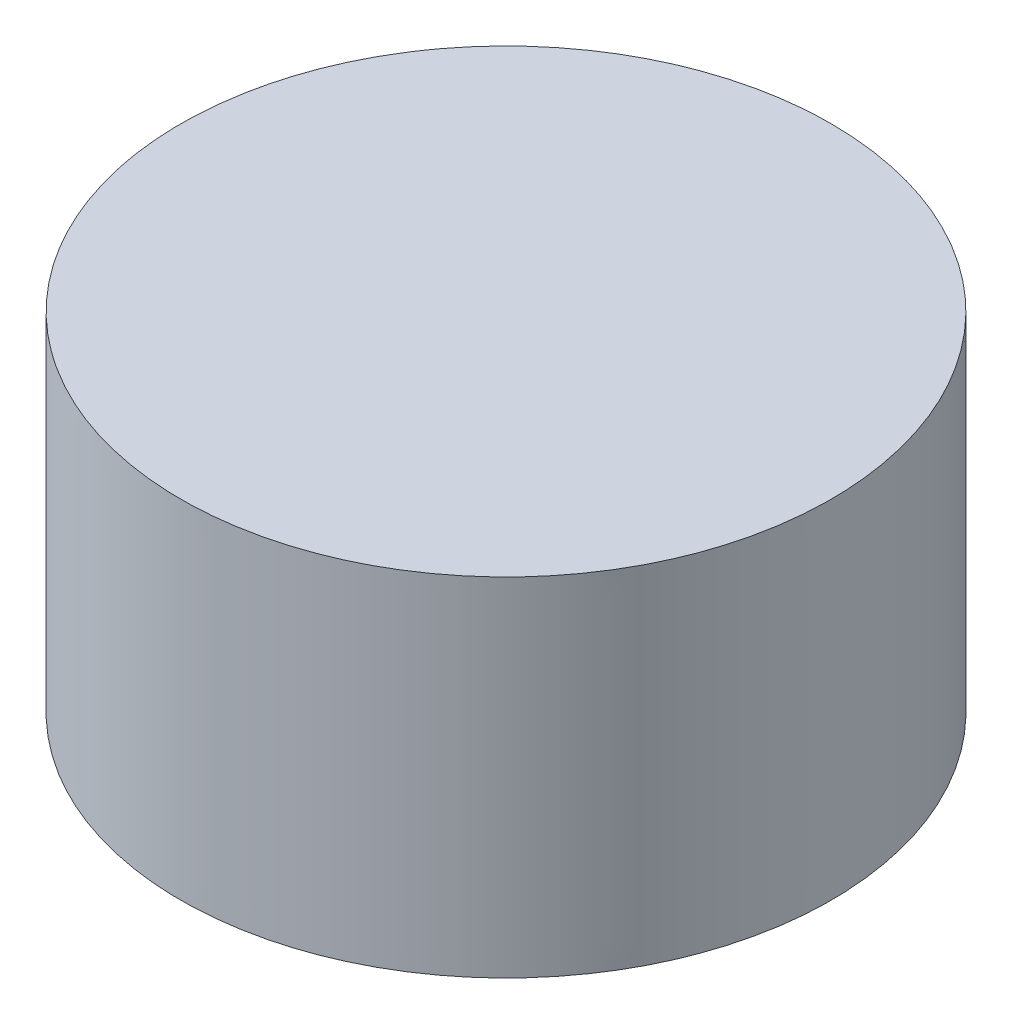
ISO-10303-21;
HEADER;
FILE_DESCRIPTION(('STEP AP214'),'2;1');
FILE_NAME('part.step','',(''),(''),'','','');
FILE_SCHEMA(('AUTOMOTIVE_DESIGN { 1 0 10303 214 1 1 1 1 }'));
ENDSEC;
DATA;
#1=APPLICATION_CONTEXT('core data for automotive mechanical design processes');
#2=APPLICATION_PROTOCOL_DEFINITION('international standard','automotive_design',2000,#1);
#3=PRODUCT_CONTEXT('',#1,'mechanical');
#4=PRODUCT('Part','Part','',(#3));
#5=PRODUCT_RELATED_PRODUCT_CATEGORY('part','',(#4));
#6=PRODUCT_DEFINITION_FORMATION('','',#4);
#7=PRODUCT_DEFINITION_CONTEXT('part definition',#1,'design');
#8=PRODUCT_DEFINITION('design','',#6,#7);
#9=PRODUCT_DEFINITION_SHAPE('','',#8);
#10=(LENGTH_UNIT() NAMED_UNIT(*) SI_UNIT(.MILLI.,.METRE.));
#11=(NAMED_UNIT(*) PLANE_ANGLE_UNIT() SI_UNIT($,.RADIAN.));
#12=(NAMED_UNIT(*) SI_UNIT($,.STERADIAN.) SOLID_ANGLE_UNIT());
#13=UNCERTAINTY_MEASURE_WITH_UNIT(LENGTH_MEASURE(1.E-05),#10,'distance_accuracy_value','');
#14=(GEOMETRIC_REPRESENTATION_CONTEXT(3) GLOBAL_UNCERTAINTY_ASSIGNED_CONTEXT((#13)) GLOBAL_UNIT_ASSIGNED_CONTEXT((#10,
#11,#12)) REPRESENTATION_CONTEXT('',''));
#15=CARTESIAN_POINT('',(0.,0.,0.));
#16=DIRECTION('',(0.,0.,1.));
#17=DIRECTION('',(1.,0.,0.));
#18=AXIS2_PLACEMENT_3D('',#15,#16,#17);
#19=CARTESIAN_POINT('',(24.0380592228744,19.7581505520302,22.3928043888786));
#20=CARTESIAN_POINT('',(23.8227248494887,19.7581505520302,22.3928043888786));
#21=CARTESIAN_POINT('',(23.3920561027171,19.7581505520302,22.4784697288553));
#22=CARTESIAN_POINT('',(22.8444011015708,19.7581505520302,22.8444011015709));
#23=CARTESIAN_POINT('',(22.4784697288552,19.7581505520302,23.3920561027172));
#24=CARTESIAN_POINT('',(22.3499717188901,19.7581505520302,24.0380592228745));
#25=CARTESIAN_POINT('',(22.4784697288552,19.7581505520302,24.6840623430318));
#26=CARTESIAN_POINT('',(22.8444011015708,19.7581505520302,25.2317173441781));
#27=CARTESIAN_POINT('',(23.3920561027171,19.7581505520302,25.5976487168937));
#28=CARTESIAN_POINT('',(24.0380592228744,19.7581505520302,25.7261467268588));
#29=CARTESIAN_POINT('',(24.6840623430318,19.7581505520302,25.5976487168937));
#30=CARTESIAN_POINT('',(25.231717344178,19.7581505520302,25.2317173441781));
#31=CARTESIAN_POINT('',(25.5976487168936,19.7581505520302,24.6840623430318));
#32=CARTESIAN_POINT('',(25.7261467268588,19.7581505520302,24.0380592228745));
#33=CARTESIAN_POINT('',(25.5976487168936,19.7581505520302,23.3920561027172));
#34=CARTESIAN_POINT('',(25.231717344178,19.7581505520302,22.8444011015709));
#35=CARTESIAN_POINT('',(24.6840623430318,19.7581505520302,22.4784697288553));
#36=CARTESIAN_POINT('',(24.2533935962602,19.7581505520302,22.3928043888786));
#37=CARTESIAN_POINT('',(24.0380592228744,19.7581505520302,22.3928043888786));
#38=B_SPLINE_CURVE_WITH_KNOTS('',3,(#19,#20,#21,#22,#23,#24,#25,#26,#27,#28,#29,#30,#31,#32,#33,
#34,#35,#36,#37),.UNSPECIFIED.,.T.,.F.,(4,1,1,1,1,1,1,1,1,1,1,1,1,1,1,1,4),(0.,
0.0625000000000003,0.125,0.1875,0.25,0.3125,0.375,0.4375,0.5,0.5625,0.625,0.6875,0.75,0.8125,
0.875,0.9375,1.),.UNSPECIFIED.);
#39=DIRECTION('',(0.,-1.,0.));
#40=VECTOR('',#39,1.);
#41=SURFACE_OF_LINEAR_EXTRUSION('',#38,#40);
#42=CARTESIAN_POINT('',(24.0380592228744,19.7581505520302,22.3928043888786));
#43=CARTESIAN_POINT('',(24.0649766546688,19.7581505520302,22.3928043693916));
#44=CARTESIAN_POINT('',(24.0918935277588,19.7581505520302,22.3934736785992));
#45=CARTESIAN_POINT('',(24.1456632509723,19.7581505520302,22.396138004237));
#46=CARTESIAN_POINT('',(24.172516097236,19.7581505520302,22.3981330986601));
#47=CARTESIAN_POINT('',(24.2260935172483,19.7581505520302,22.4034362234734));
#48=CARTESIAN_POINT('',(24.2528180820671,19.7581505520302,22.4067443439608));
#49=CARTESIAN_POINT('',(24.3060750768237,19.7581505520302,22.4146607949939));
#50=CARTESIAN_POINT('',(24.3326074984245,19.7581505520302,22.4192691816158));
#51=CARTESIAN_POINT('',(24.3854162291896,19.7581505520302,22.429773490408));
#52=CARTESIAN_POINT('',(24.4116925383541,19.7581505520302,22.4356694125783));
#53=CARTESIAN_POINT('',(24.4639250907171,19.7581505520302,22.448736140547));
#54=CARTESIAN_POINT('',(24.4898813476716,19.7581505520302,22.4559068913467));
#55=CARTESIAN_POINT('',(24.5414098059416,19.7581505520302,22.4715106135327));
#56=CARTESIAN_POINT('',(24.5669820334906,19.7581505520302,22.479943498265));
#57=CARTESIAN_POINT('',(24.6176785291713,19.7581505520302,22.4980588403858));
#58=CARTESIAN_POINT('',(24.6428028235676,19.7581505520302,22.5077412242334));
#59=CARTESIAN_POINT('',(24.692539156159,19.7581505520302,22.5283426877273));
#60=CARTESIAN_POINT('',(24.717151194354,19.7581505520302,22.5392617673736));
#61=CARTESIAN_POINT('',(24.7658085115272,19.7581505520302,22.5623001220429));
#62=CARTESIAN_POINT('',(24.7898537570761,19.7581505520302,22.5744194676391));
#63=CARTESIAN_POINT('',(24.8373233769549,19.7581505520302,22.5998220919573));
#64=CARTESIAN_POINT('',(24.8607477085612,19.7581505520302,22.6131054505028));
#65=CARTESIAN_POINT('',(24.9069212730822,19.7581505520302,22.6407998711911));
#66=CARTESIAN_POINT('',(24.9296704768339,19.7581505520302,22.6552109819509));
#67=CARTESIAN_POINT('',(24.9744395542325,19.7581505520302,22.6851247231079));
#68=CARTESIAN_POINT('',(24.9964594278794,19.7581505520302,22.7006273535052));
#69=CARTESIAN_POINT('',(25.0397155944736,19.7581505520302,22.7326879687432));
#70=CARTESIAN_POINT('',(25.0609519211769,19.7581505520302,22.7492459080359));
#71=CARTESIAN_POINT('',(25.1025867229244,19.7581505520302,22.7833809547917));
#72=CARTESIAN_POINT('',(25.1229852553663,19.7581505520302,22.8009579922361));
#73=CARTESIAN_POINT('',(25.1628902688551,19.7581505520302,22.8370950950428));
#74=CARTESIAN_POINT('',(25.1823968023102,19.7581505520302,22.8556551025133));
#75=CARTESIAN_POINT('',(25.2204633432357,19.7581505520302,22.8937216434388));
#76=CARTESIAN_POINT('',(25.2390233507061,19.7581505520302,22.9132281768938));
#77=CARTESIAN_POINT('',(25.2751604535128,19.7581505520302,22.9531331903826));
#78=CARTESIAN_POINT('',(25.2927374909573,19.7581505520302,22.9735317228245));
#79=CARTESIAN_POINT('',(25.3268725377131,19.7581505520302,23.0151665245721));
#80=CARTESIAN_POINT('',(25.3434304770058,19.7581505520302,23.0364028512754));
#81=CARTESIAN_POINT('',(25.3754910922437,19.7581505520302,23.0796590178695));
#82=CARTESIAN_POINT('',(25.390993722641,19.7581505520302,23.1016788915165));
#83=CARTESIAN_POINT('',(25.4209074637981,19.7581505520302,23.146447968915));
#84=CARTESIAN_POINT('',(25.4353185745578,19.7581505520302,23.1691971726666));
#85=CARTESIAN_POINT('',(25.4630129952461,19.7581505520302,23.2153707371879));
#86=CARTESIAN_POINT('',(25.4762963537916,19.7581505520302,23.2387950687946));
#87=CARTESIAN_POINT('',(25.5016989781098,19.7581505520302,23.2862646886722));
#88=CARTESIAN_POINT('',(25.5138183237061,19.7581505520302,23.3103099342194));
#89=CARTESIAN_POINT('',(25.5368566783752,19.7581505520302,23.3589672513972));
#90=CARTESIAN_POINT('',(25.5477757580211,19.7581505520302,23.3835792895986));
#91=CARTESIAN_POINT('',(25.568377221516,19.7581505520302,23.4333156221728));
#92=CARTESIAN_POINT('',(25.5780596053651,19.7581505520302,23.4584399165457));
#93=CARTESIAN_POINT('',(25.596174947482,19.7581505520302,23.5091364122903));
#94=CARTESIAN_POINT('',(25.604607832209,19.7581505520302,23.5347086399268));
#95=CARTESIAN_POINT('',(25.6202115544094,19.7581505520302,23.5862370979579));
#96=CARTESIAN_POINT('',(25.6273823052289,19.7581505520302,23.6121933545863));
#97=CARTESIAN_POINT('',(25.6404490331437,19.7581505520302,23.6644259078405));
#98=CARTESIAN_POINT('',(25.6463449552404,19.7581505520302,23.6907022182225));
#99=CARTESIAN_POINT('',(25.6568492642336,19.7581505520302,23.7435109456613));
#100=CARTESIAN_POINT('',(25.66145765113,19.7581505520302,23.7700433627181));
#101=CARTESIAN_POINT('',(25.6693741014131,19.7581505520302,23.8233003698887));
#102=CARTESIAN_POINT('',(25.6726822208762,19.7581505520302,23.8500249516645));
#103=CARTESIAN_POINT('',(25.6779853484881,19.7581505520302,23.9036023253506));
#104=CARTESIAN_POINT('',(25.6799804467339,19.7581505520302,23.9304551083367));
#105=CARTESIAN_POINT('',(25.6826447619281,19.7581505520302,23.984225004425));
#106=CARTESIAN_POINT('',(25.6833140568704,19.7581505520302,24.0111421136498));
#107=CARTESIAN_POINT('',(25.6833140568704,19.7581505520302,24.0649763320992));
#108=CARTESIAN_POINT('',(25.6826447619281,19.7581505520302,24.091893441324));
#109=CARTESIAN_POINT('',(25.6799804467339,19.7581505520302,24.1456633374123));
#110=CARTESIAN_POINT('',(25.6779853484881,19.7581505520302,24.1725161203984));
#111=CARTESIAN_POINT('',(25.6726822208762,19.7581505520302,24.2260934940845));
#112=CARTESIAN_POINT('',(25.6693741014131,19.7581505520302,24.2528180758603));
#113=CARTESIAN_POINT('',(25.66145765113,19.7581505520302,24.3060750830309));
#114=CARTESIAN_POINT('',(25.6568492642336,19.7581505520302,24.3326075000877));
#115=CARTESIAN_POINT('',(25.6463449552404,19.7581505520302,24.3854162275265));
#116=CARTESIAN_POINT('',(25.6404490331437,19.7581505520302,24.4116925379085));
#117=CARTESIAN_POINT('',(25.6273823052289,19.7581505520302,24.4639250911627));
#118=CARTESIAN_POINT('',(25.6202115544094,19.7581505520302,24.4898813477911));
#119=CARTESIAN_POINT('',(25.604607832209,19.7581505520302,24.5414098058222));
#120=CARTESIAN_POINT('',(25.596174947482,19.7581505520302,24.5669820334587));
#121=CARTESIAN_POINT('',(25.5780596053651,19.7581505520302,24.6176785292033));
#122=CARTESIAN_POINT('',(25.568377221516,19.7581505520302,24.6428028235762));
#123=CARTESIAN_POINT('',(25.5477757580211,19.7581505520302,24.6925391561504));
#124=CARTESIAN_POINT('',(25.5368566783752,19.7581505520302,24.7171511943518));
#125=CARTESIAN_POINT('',(25.5138183237061,19.7581505520302,24.7658085115296));
#126=CARTESIAN_POINT('',(25.5016989781098,19.7581505520302,24.7898537570768));
#127=CARTESIAN_POINT('',(25.4762963537916,19.7581505520302,24.8373233769544));
#128=CARTESIAN_POINT('',(25.4630129952461,19.7581505520302,24.8607477085611));
#129=CARTESIAN_POINT('',(25.4353185745578,19.7581505520302,24.9069212730824));
#130=CARTESIAN_POINT('',(25.4209074637981,19.7581505520302,24.929670476834));
#131=CARTESIAN_POINT('',(25.390993722641,19.7581505520302,24.9744395542325));
#132=CARTESIAN_POINT('',(25.3754910922437,19.7581505520302,24.9964594278795));
#133=CARTESIAN_POINT('',(25.3434304770058,19.7581505520302,25.0397155944736));
#134=CARTESIAN_POINT('',(25.3268725377131,19.7581505520302,25.0609519211769));
#135=CARTESIAN_POINT('',(25.2927374909573,19.7581505520302,25.1025867229245));
#136=CARTESIAN_POINT('',(25.2751604535128,19.7581505520302,25.1229852553664));
#137=CARTESIAN_POINT('',(25.2390233507061,19.7581505520302,25.1628902688552));
#138=CARTESIAN_POINT('',(25.2204633432357,19.7581505520302,25.1823968023102));
#139=CARTESIAN_POINT('',(25.1823968023102,19.7581505520302,25.2204633432357));
#140=CARTESIAN_POINT('',(25.1628902688551,19.7581505520302,25.2390233507062));
#141=CARTESIAN_POINT('',(25.1229852553663,19.7581505520302,25.2751604535129));
#142=CARTESIAN_POINT('',(25.1025867229244,19.7581505520302,25.2927374909573));
#143=CARTESIAN_POINT('',(25.0609519211769,19.7581505520302,25.3268725377131));
#144=CARTESIAN_POINT('',(25.0397155944736,19.7581505520302,25.3434304770058));
#145=CARTESIAN_POINT('',(24.9964594278794,19.7581505520302,25.3754910922438));
#146=CARTESIAN_POINT('',(24.9744395542325,19.7581505520302,25.3909937226411));
#147=CARTESIAN_POINT('',(24.9296704768339,19.7581505520302,25.4209074637981));
#148=CARTESIAN_POINT('',(24.9069212730823,19.7581505520302,25.4353185745579));
#149=CARTESIAN_POINT('',(24.8607477085611,19.7581505520302,25.4630129952462));
#150=CARTESIAN_POINT('',(24.8373233769543,19.7581505520302,25.4762963537916));
#151=CARTESIAN_POINT('',(24.7898537570767,19.7581505520302,25.5016989781099));
#152=CARTESIAN_POINT('',(24.7658085115295,19.7581505520302,25.5138183237062));
#153=CARTESIAN_POINT('',(24.7171511943517,19.7581505520302,25.5368566783753));
#154=CARTESIAN_POINT('',(24.6925391561504,19.7581505520302,25.5477757580211));
#155=CARTESIAN_POINT('',(24.6428028235762,19.7581505520302,25.5683772215161));
#156=CARTESIAN_POINT('',(24.6176785292033,19.7581505520302,25.5780596053652));
#157=CARTESIAN_POINT('',(24.5669820334586,19.7581505520302,25.5961749474821));
#158=CARTESIAN_POINT('',(24.5414098058222,19.7581505520302,25.6046078322091));
#159=CARTESIAN_POINT('',(24.489881347791,19.7581505520302,25.6202115544095));
#160=CARTESIAN_POINT('',(24.4639250911627,19.7581505520302,25.627382305229));
#161=CARTESIAN_POINT('',(24.4116925379085,19.7581505520302,25.6404490331438));
#162=CARTESIAN_POINT('',(24.3854162275264,19.7581505520302,25.6463449552405));
#163=CARTESIAN_POINT('',(24.3326075000876,19.7581505520302,25.6568492642337));
#164=CARTESIAN_POINT('',(24.3060750830309,19.7581505520302,25.6614576511301));
#165=CARTESIAN_POINT('',(24.2528180758602,19.7581505520302,25.6693741014132));
#166=CARTESIAN_POINT('',(24.2260934940845,19.7581505520302,25.6726822208763));
#167=CARTESIAN_POINT('',(24.1725161203983,19.7581505520302,25.6779853484882));
#168=CARTESIAN_POINT('',(24.1456633374122,19.7581505520302,25.679980446734));
#169=CARTESIAN_POINT('',(24.0918934413239,19.7581505520302,25.6826447619282));
#170=CARTESIAN_POINT('',(24.0649763320992,19.7581505520302,25.6833140568704));
#171=CARTESIAN_POINT('',(24.0111421136497,19.7581505520302,25.6833140568704));
#172=CARTESIAN_POINT('',(23.9842250044249,19.7581505520302,25.6826447619282));
#173=CARTESIAN_POINT('',(23.9304551083367,19.7581505520302,25.679980446734));
#174=CARTESIAN_POINT('',(23.9036023253506,19.7581505520302,25.6779853484882));
#175=CARTESIAN_POINT('',(23.8500249516644,19.7581505520302,25.6726822208763));
#176=CARTESIAN_POINT('',(23.8233003698886,19.7581505520302,25.6693741014132));
#177=CARTESIAN_POINT('',(23.770043362718,19.7581505520302,25.6614576511301));
#178=CARTESIAN_POINT('',(23.7435109456612,19.7581505520302,25.6568492642336));
#179=CARTESIAN_POINT('',(23.6907022182224,19.7581505520302,25.6463449552405));
#180=CARTESIAN_POINT('',(23.6644259078404,19.7581505520302,25.6404490331438));
#181=CARTESIAN_POINT('',(23.6121933545862,19.7581505520302,25.627382305229));
#182=CARTESIAN_POINT('',(23.5862370979578,19.7581505520302,25.6202115544095));
#183=CARTESIAN_POINT('',(23.5347086399267,19.7581505520302,25.6046078322091));
#184=CARTESIAN_POINT('',(23.5091364122903,19.7581505520302,25.5961749474821));
#185=CARTESIAN_POINT('',(23.4584399165456,19.7581505520302,25.5780596053652));
#186=CARTESIAN_POINT('',(23.4333156221727,19.7581505520302,25.5683772215161));
#187=CARTESIAN_POINT('',(23.3835792895985,19.7581505520302,25.5477757580211));
#188=CARTESIAN_POINT('',(23.3589672513972,19.7581505520302,25.5368566783753));
#189=CARTESIAN_POINT('',(23.3103099342194,19.7581505520302,25.5138183237062));
#190=CARTESIAN_POINT('',(23.2862646886721,19.7581505520302,25.5016989781099));
#191=CARTESIAN_POINT('',(23.2387950687946,19.7581505520302,25.4762963537916));
#192=CARTESIAN_POINT('',(23.2153707371878,19.7581505520302,25.4630129952461));
#193=CARTESIAN_POINT('',(23.1691971726666,19.7581505520302,25.4353185745579));
#194=CARTESIAN_POINT('',(23.1464479689149,19.7581505520302,25.4209074637981));
#195=CARTESIAN_POINT('',(23.1016788915164,19.7581505520302,25.3909937226411));
#196=CARTESIAN_POINT('',(23.0796590178695,19.7581505520302,25.3754910922438));
#197=CARTESIAN_POINT('',(23.0364028512753,19.7581505520302,25.3434304770058));
#198=CARTESIAN_POINT('',(23.015166524572,19.7581505520302,25.3268725377131));
#199=CARTESIAN_POINT('',(22.9735317228245,19.7581505520302,25.2927374909573));
#200=CARTESIAN_POINT('',(22.9531331903825,19.7581505520302,25.2751604535129));
#201=CARTESIAN_POINT('',(22.9132281768938,19.7581505520302,25.2390233507062));
#202=CARTESIAN_POINT('',(22.8937216434387,19.7581505520302,25.2204633432357));
#203=CARTESIAN_POINT('',(22.8556551025132,19.7581505520302,25.1823968023102));
#204=CARTESIAN_POINT('',(22.8370950950427,19.7581505520302,25.1628902688552));
#205=CARTESIAN_POINT('',(22.8009579922361,19.7581505520302,25.1229852553664));
#206=CARTESIAN_POINT('',(22.7833809547916,19.7581505520302,25.1025867229245));
#207=CARTESIAN_POINT('',(22.7492459080358,19.7581505520302,25.0609519211769));
#208=CARTESIAN_POINT('',(22.7326879687431,19.7581505520302,25.0397155944736));
#209=CARTESIAN_POINT('',(22.7006273535052,19.7581505520302,24.9964594278795));
#210=CARTESIAN_POINT('',(22.6851247231078,19.7581505520302,24.9744395542325));
#211=CARTESIAN_POINT('',(22.6552109819508,19.7581505520302,24.929670476834));
#212=CARTESIAN_POINT('',(22.640799871191,19.7581505520302,24.9069212730824));
#213=CARTESIAN_POINT('',(22.6131054505028,19.7581505520302,24.8607477085611));
#214=CARTESIAN_POINT('',(22.5998220919573,19.7581505520302,24.8373233769544));
#215=CARTESIAN_POINT('',(22.574419467639,19.7581505520302,24.7898537570768));
#216=CARTESIAN_POINT('',(22.5623001220427,19.7581505520302,24.7658085115296));
#217=CARTESIAN_POINT('',(22.5392617673737,19.7581505520302,24.7171511943518));
#218=CARTESIAN_POINT('',(22.5283426877278,19.7581505520302,24.6925391561504));
#219=CARTESIAN_POINT('',(22.5077412242329,19.7581505520302,24.6428028235762));
#220=CARTESIAN_POINT('',(22.4980588403838,19.7581505520302,24.6176785292033));
#221=CARTESIAN_POINT('',(22.4799434982669,19.7581505520302,24.5669820334587));
#222=CARTESIAN_POINT('',(22.4715106135398,19.7581505520302,24.5414098058222));
#223=CARTESIAN_POINT('',(22.4559068913394,19.7581505520302,24.4898813477911));
#224=CARTESIAN_POINT('',(22.44873614052,19.7581505520302,24.4639250911627));
#225=CARTESIAN_POINT('',(22.4356694126051,19.7581505520302,24.4116925379085));
#226=CARTESIAN_POINT('',(22.4297734905084,19.7581505520302,24.3854162275265));
#227=CARTESIAN_POINT('',(22.4192691815153,19.7581505520302,24.3326075000877));
#228=CARTESIAN_POINT('',(22.4146607946188,19.7581505520302,24.3060750830309));
#229=CARTESIAN_POINT('',(22.4067443443357,19.7581505520302,24.2528180758603));
#230=CARTESIAN_POINT('',(22.4034362248727,19.7581505520302,24.2260934940845));
#231=CARTESIAN_POINT('',(22.3981330972608,19.7581505520302,24.1725161203984));
#232=CARTESIAN_POINT('',(22.396137999015,19.7581505520302,24.1456633374123));
#233=CARTESIAN_POINT('',(22.3934736838208,19.7581505520302,24.091893441324));
#234=CARTESIAN_POINT('',(22.3928043888785,19.7581505520302,24.0649763320993));
#235=CARTESIAN_POINT('',(22.3928043888785,19.7581505520302,24.0111421136498));
#236=CARTESIAN_POINT('',(22.3934736838208,19.7581505520302,23.984225004425));
#237=CARTESIAN_POINT('',(22.396137999015,19.7581505520302,23.9304551083367));
#238=CARTESIAN_POINT('',(22.3981330972608,19.7581505520302,23.9036023253506));
#239=CARTESIAN_POINT('',(22.4034362248727,19.7581505520302,23.8500249516645));
#240=CARTESIAN_POINT('',(22.4067443443357,19.7581505520302,23.8233003698887));
#241=CARTESIAN_POINT('',(22.4146607946188,19.7581505520302,23.7700433627181));
#242=CARTESIAN_POINT('',(22.4192691815153,19.7581505520302,23.7435109456613));
#243=CARTESIAN_POINT('',(22.4297734905084,19.7581505520302,23.6907022182225));
#244=CARTESIAN_POINT('',(22.4356694126051,19.7581505520302,23.6644259078405));
#245=CARTESIAN_POINT('',(22.44873614052,19.7581505520302,23.6121933545863));
#246=CARTESIAN_POINT('',(22.4559068913394,19.7581505520302,23.5862370979579));
#247=CARTESIAN_POINT('',(22.4715106135398,19.7581505520302,23.5347086399268));
#248=CARTESIAN_POINT('',(22.4799434982669,19.7581505520302,23.5091364122903));
#249=CARTESIAN_POINT('',(22.4980588403838,19.7581505520302,23.4584399165457));
#250=CARTESIAN_POINT('',(22.5077412242329,19.7581505520302,23.4333156221728));
#251=CARTESIAN_POINT('',(22.5283426877278,19.7581505520302,23.3835792895986));
#252=CARTESIAN_POINT('',(22.5392617673737,19.7581505520302,23.3589672513972));
#253=CARTESIAN_POINT('',(22.5623001220427,19.7581505520302,23.3103099342194));
#254=CARTESIAN_POINT('',(22.574419467639,19.7581505520302,23.2862646886722));
#255=CARTESIAN_POINT('',(22.5998220919573,19.7581505520302,23.2387950687946));
#256=CARTESIAN_POINT('',(22.6131054505028,19.7581505520302,23.2153707371879));
#257=CARTESIAN_POINT('',(22.640799871191,19.7581505520302,23.1691971726666));
#258=CARTESIAN_POINT('',(22.6552109819508,19.7581505520302,23.146447968915));
#259=CARTESIAN_POINT('',(22.6851247231078,19.7581505520302,23.1016788915165));
#260=CARTESIAN_POINT('',(22.7006273535052,19.7581505520302,23.0796590178695));
#261=CARTESIAN_POINT('',(22.7326879687431,19.7581505520302,23.0364028512754));
#262=CARTESIAN_POINT('',(22.7492459080358,19.7581505520302,23.0151665245721));
#263=CARTESIAN_POINT('',(22.7833809547916,19.7581505520302,22.9735317228245));
#264=CARTESIAN_POINT('',(22.8009579922361,19.7581505520302,22.9531331903826));
#265=CARTESIAN_POINT('',(22.8370950950427,19.7581505520302,22.9132281768938));
#266=CARTESIAN_POINT('',(22.8556551025132,19.7581505520302,22.8937216434388));
#267=CARTESIAN_POINT('',(22.8937216434387,19.7581505520302,22.8556551025133));
#268=CARTESIAN_POINT('',(22.9132281768938,19.7581505520302,22.8370950950428));
#269=CARTESIAN_POINT('',(22.9531331903825,19.7581505520302,22.8009579922361));
#270=CARTESIAN_POINT('',(22.9735317228245,19.7581505520302,22.7833809547917));
#271=CARTESIAN_POINT('',(23.015166524572,19.7581505520302,22.7492459080359));
#272=CARTESIAN_POINT('',(23.0364028512753,19.7581505520302,22.7326879687432));
#273=CARTESIAN_POINT('',(23.0796590178695,19.7581505520302,22.7006273535052));
#274=CARTESIAN_POINT('',(23.1016788915164,19.7581505520302,22.6851247231079));
#275=CARTESIAN_POINT('',(23.146447968915,19.7581505520302,22.6552109819509));
#276=CARTESIAN_POINT('',(23.1691971726667,19.7581505520302,22.6407998711911));
#277=CARTESIAN_POINT('',(23.2153707371877,19.7581505520302,22.6131054505028));
#278=CARTESIAN_POINT('',(23.238795068794,19.7581505520302,22.5998220919573));
#279=CARTESIAN_POINT('',(23.2862646886727,19.7581505520302,22.5744194676391));
#280=CARTESIAN_POINT('',(23.3103099342216,19.7581505520302,22.5623001220429));
#281=CARTESIAN_POINT('',(23.3589672513949,19.7581505520302,22.5392617673736));
#282=CARTESIAN_POINT('',(23.3835792895899,19.7581505520302,22.5283426877273));
#283=CARTESIAN_POINT('',(23.4333156221813,19.7581505520302,22.5077412242334));
#284=CARTESIAN_POINT('',(23.4584399165776,19.7581505520302,22.4980588403858));
#285=CARTESIAN_POINT('',(23.5091364122583,19.7581505520302,22.479943498265));
#286=CARTESIAN_POINT('',(23.5347086398073,19.7581505520302,22.4715106135327));
#287=CARTESIAN_POINT('',(23.5862370980772,19.7581505520302,22.4559068913467));
#288=CARTESIAN_POINT('',(23.6121933550318,19.7581505520302,22.448736140547));
#289=CARTESIAN_POINT('',(23.6644259073948,19.7581505520302,22.4356694125783));
#290=CARTESIAN_POINT('',(23.6907022165592,19.7581505520302,22.429773490408));
#291=CARTESIAN_POINT('',(23.7435109473244,19.7581505520302,22.4192691816158));
#292=CARTESIAN_POINT('',(23.7700433689251,19.7581505520302,22.4146607949939));
#293=CARTESIAN_POINT('',(23.8233003636818,19.7581505520302,22.4067443439608));
#294=CARTESIAN_POINT('',(23.8500249285005,19.7581505520302,22.4034362234734));
#295=CARTESIAN_POINT('',(23.9036023485128,19.7581505520302,22.3981330986601));
#296=CARTESIAN_POINT('',(23.9304551947766,19.7581505520302,22.396138004237));
#297=CARTESIAN_POINT('',(23.9842249179901,19.7581505520302,22.3934736785992));
#298=CARTESIAN_POINT('',(24.0111417910801,19.7581505520302,22.3928043693916));
#299=CARTESIAN_POINT('',(24.0380592228744,19.7581505520302,22.3928043888786));
#300=B_SPLINE_CURVE_WITH_KNOTS('',3,(#42,#43,#44,#45,#46,#47,#48,#49,#50,#51,#52,#53,#54,#55,
#56,#57,#58,#59,#60,#61,#62,#63,#64,#65,#66,#67,#68,#69,#70,#71,#72,#73,#74,#75,#76,#77,#78,#79,
#80,#81,#82,#83,#84,#85,#86,#87,#88,#89,#90,#91,#92,#93,#94,#95,#96,#97,#98,#99,#100,#101,#102,
#103,#104,#105,#106,#107,#108,#109,#110,#111,#112,#113,#114,#115,#116,#117,#118,#119,#120,#121,
#122,#123,#124,#125,#126,#127,#128,#129,#130,#131,#132,#133,#134,#135,#136,#137,#138,#139,#140,
#141,#142,#143,#144,#145,#146,#147,#148,#149,#150,#151,#152,#153,#154,#155,#156,#157,#158,#159,
#160,#161,#162,#163,#164,#165,#166,#167,#168,#169,#170,#171,#172,#173,#174,#175,#176,#177,#178,
#179,#180,#181,#182,#183,#184,#185,#186,#187,#188,#189,#190,#191,#192,#193,#194,#195,#196,#197,
#198,#199,#200,#201,#202,#203,#204,#205,#206,#207,#208,#209,#210,#211,#212,#213,#214,#215,#216,
#217,#218,#219,#220,#221,#222,#223,#224,#225,#226,#227,#228,#229,#230,#231,#232,#233,#234,#235,
#236,#237,#238,#239,#240,#241,#242,#243,#244,#245,#246,#247,#248,#249,#250,#251,#252,#253,#254,
#255,#256,#257,#258,#259,#260,#261,#262,#263,#264,#265,#266,#267,#268,#269,#270,#271,#272,#273,
#274,#275,#276,#277,#278,#279,#280,#281,#282,#283,#284,#285,#286,#287,#288,#289,#290,#291,#292,
#293,#294,#295,#296,#297,#298,#299),.UNSPECIFIED.,.F.,.F.,(4,2,2,2,2,2,2,2,2,2,2,2,2,2,2,2,2,2,
2,2,2,2,2,2,2,2,2,2,2,2,2,2,2,2,2,2,2,2,2,2,2,2,2,2,2,2,2,2,2,2,2,2,2,2,2,2,2,2,2,2,2,2,2,2,2,2,
2,2,2,2,2,2,2,2,2,2,2,2,2,2,2,2,2,2,2,2,2,2,2,2,2,2,2,2,2,2,2,2,2,2,2,2,2,2,2,2,2,2,2,2,2,2,2,2,
2,2,2,2,2,2,2,2,2,2,2,2,2,2,4),(0.,0.0807431843828226,0.161491119116277,0.242244595572287,
0.323001555202126,0.403758514831959,0.48451199128797,0.565259926021422,0.646003110404242,
0.726746294787064,0.807494229520513,0.888247705976533,0.969004665606359,1.0497616252362,
1.1305151016922,1.21126303642566,1.29200622080848,1.3727494051913,1.45349733992476,
1.53425081638077,1.6150077760106,1.69576473564043,1.77651821209644,1.8572661468299,
1.93800933121271,2.01875251559553,2.09950045032899,2.180253926785,2.26101088641483,
2.34176784604467,2.42252132250068,2.50326925723413,2.58401244161696,2.66475562599978,
2.74550356073323,2.82625703718924,2.90701399681908,2.9877709564489,3.06852443290492,
3.14927236763838,3.23001555202119,3.31075873640402,3.39150667113747,3.47226014759348,
3.55301710722331,3.63377406685314,3.71452754330916,3.79527547804261,3.87601866242543,
3.95676184680825,4.03750978154171,4.11826325799772,4.19902021762755,4.27977717725738,
4.3605306537134,4.44127858844686,4.52202177282968,4.60276495721249,4.68351289194595,
4.76426636840197,4.84502332803179,4.92578028766163,5.00653376411764,5.0872816988511,
5.16802488323392,5.24876806761674,5.32951600235019,5.41026947880621,5.49102643843604,
5.57178339806587,5.65253687452188,5.73328480925533,5.81402799363816,5.89477117802097,
5.97551911275443,6.05627258921045,6.13702954884028,6.21778650847011,6.29853998492612,
6.37928791965957,6.4600311040424,6.54077428842522,6.62152222315867,6.70227569961469,
6.78303265924452,6.86378961887435,6.94454309533036,7.02529103006382,7.10603421444664,
7.18677739882946,7.26752533356291,7.34827881001892,7.42903576964876,7.50979272927859,
7.5905462057346,7.67129414046805,7.75203732485087,7.83278050923369,7.91352844396715,
7.99428192042317,8.075038880053,8.15579583968283,8.23654931613884,8.3172972508723,
8.39804043525512,8.47878361963793,8.55953155437139,8.6402850308274,8.72104199045723,
8.80179895008707,8.88255242654308,8.96330036127653,9.04404354565935,9.12478673004218,
9.20553466477563,9.28628814123164,9.36704510086147,9.44780206049131,9.52855553694732,
9.60930347168077,9.6900466560636,9.77078984044642,9.85153777517987,9.93229125163588,
10.0130482112657,10.0938051708955,10.1745586473516,10.255306582085,10.3360497664678),.UNSPECIFIED.);
#301=CARTESIAN_POINT('',(24.0380592228744,19.7581505520302,22.3928043888786));
#302=VERTEX_POINT('',#301);
#303=EDGE_CURVE('E9',#302,#302,#300,.F.);
#304=ORIENTED_EDGE('',*,*,#303,.F.);
#305=EDGE_LOOP('',(#304));
#306=FACE_BOUND('',#305,.T.);
#307=CARTESIAN_POINT('',(24.0380592228744,18.001,22.3928043888786));
#308=CARTESIAN_POINT('',(23.8227248494887,18.001,22.3928043888786));
#309=CARTESIAN_POINT('',(23.3920561027171,18.001,22.4784697288553));
#310=CARTESIAN_POINT('',(22.8444011015708,18.001,22.8444011015709));
#311=CARTESIAN_POINT('',(22.4784697288552,18.001,23.3920561027172));
#312=CARTESIAN_POINT('',(22.3499717188901,18.001,24.0380592228745));
#313=CARTESIAN_POINT('',(22.4784697288552,18.001,24.6840623430318));
#314=CARTESIAN_POINT('',(22.8444011015708,18.001,25.2317173441781));
#315=CARTESIAN_POINT('',(23.3920561027171,18.001,25.5976487168937));
#316=CARTESIAN_POINT('',(24.0380592228744,18.001,25.7261467268588));
#317=CARTESIAN_POINT('',(24.6840623430318,18.001,25.5976487168937));
#318=CARTESIAN_POINT('',(25.231717344178,18.001,25.2317173441781));
#319=CARTESIAN_POINT('',(25.5976487168936,18.001,24.6840623430318));
#320=CARTESIAN_POINT('',(25.7261467268588,18.001,24.0380592228745));
#321=CARTESIAN_POINT('',(25.5976487168936,18.001,23.3920561027172));
#322=CARTESIAN_POINT('',(25.231717344178,18.001,22.8444011015709));
#323=CARTESIAN_POINT('',(24.6840623430318,18.001,22.4784697288553));
#324=CARTESIAN_POINT('',(24.2533935962602,18.001,22.3928043888786));
#325=CARTESIAN_POINT('',(24.0380592228744,18.001,22.3928043888786));
#326=B_SPLINE_CURVE_WITH_KNOTS('',3,(#307,#308,#309,#310,#311,#312,#313,#314,#315,#316,#317,
#318,#319,#320,#321,#322,#323,#324,#325),.UNSPECIFIED.,.T.,.F.,(4,1,1,1,1,1,1,1,1,1,1,1,1,1,1,1,
4),(0.,0.0625000000000003,0.125,0.1875,0.25,0.3125,0.375,0.4375,0.5,0.5625,0.625,0.6875,0.75,
0.8125,0.875,0.9375,1.),.UNSPECIFIED.);
#327=CARTESIAN_POINT('',(24.0380592228744,18.001,22.3928043888786));
#328=VERTEX_POINT('',#327);
#329=EDGE_CURVE('E24',#328,#328,#326,.T.);
#330=ORIENTED_EDGE('',*,*,#329,.T.);
#331=EDGE_LOOP('',(#330));
#332=FACE_BOUND('',#331,.T.);
#333=ADVANCED_FACE('F14',(#306,#332),#41,.F.);
#334=CARTESIAN_POINT('',(70.,19.7581505520302,47.0000000000001));
#335=DIRECTION('',(0.,-1.,0.));
#336=DIRECTION('',(1.,0.,0.));
#337=AXIS2_PLACEMENT_3D('',#334,#335,#336);
#338=PLANE('',#337);
#339=ORIENTED_EDGE('',*,*,#303,.T.);
#340=EDGE_LOOP('',(#339));
#341=FACE_BOUND('',#340,.T.);
#342=ADVANCED_FACE('F59',(#341),#338,.F.);
#343=CARTESIAN_POINT('',(70.,18.001,47.0000000000001));
#344=DIRECTION('',(0.,-1.,0.));
#345=DIRECTION('',(1.,0.,0.));
#346=AXIS2_PLACEMENT_3D('',#343,#344,#345);
#347=PLANE('',#346);
#348=ORIENTED_EDGE('',*,*,#329,.F.);
#349=EDGE_LOOP('',(#348));
#350=FACE_BOUND('',#349,.T.);
#351=ADVANCED_FACE('F67',(#350),#347,.T.);
#352=CLOSED_SHELL('',(#333,#342,#351));
#353=MANIFOLD_SOLID_BREP('B1',#352);
#354=ADVANCED_BREP_SHAPE_REPRESENTATION('',(#18,#353),#14);
#355=SHAPE_DEFINITION_REPRESENTATION(#9,#354);
ENDSEC;
END-ISO-10303-21;
